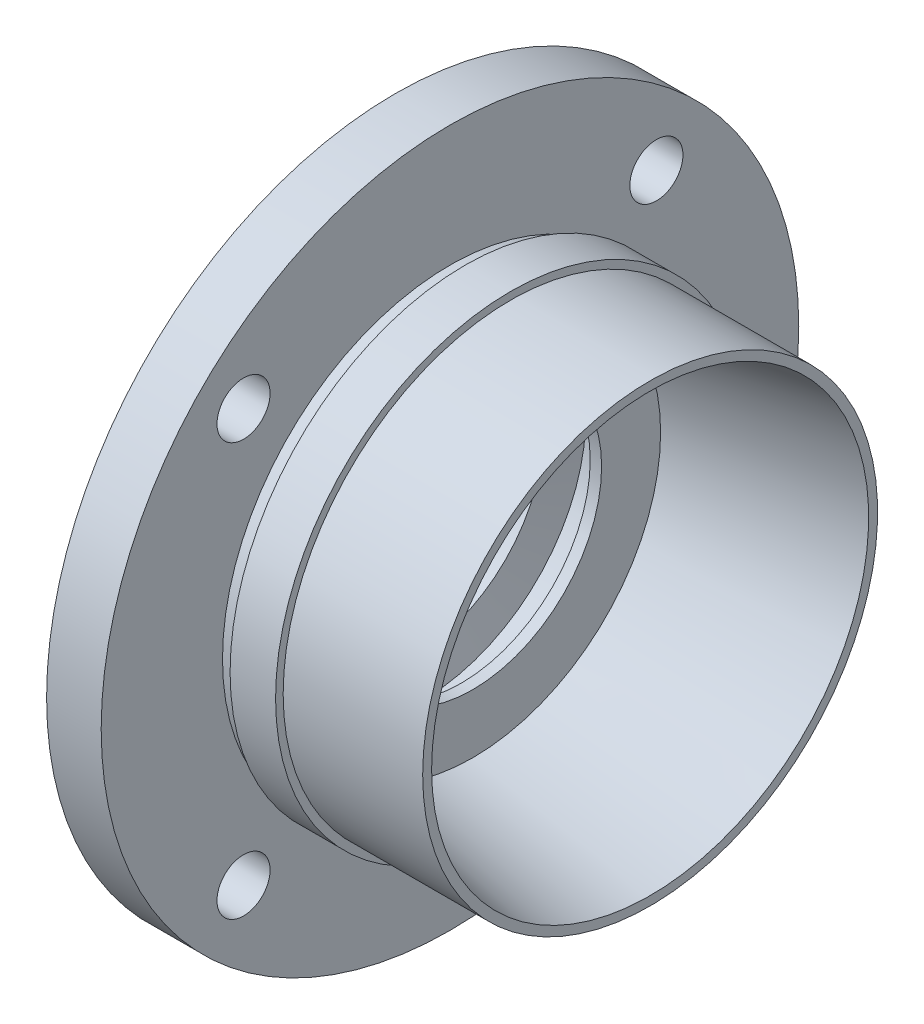
ISO-10303-21;
HEADER;
FILE_DESCRIPTION(('STEP AP214'),'2;1');
FILE_NAME('part.step','',(''),(''),'','','');
FILE_SCHEMA(('AUTOMOTIVE_DESIGN { 1 0 10303 214 1 1 1 1 }'));
ENDSEC;
DATA;
#1=APPLICATION_CONTEXT('core data for automotive mechanical design processes');
#2=APPLICATION_PROTOCOL_DEFINITION('international standard','automotive_design',2000,#1);
#3=PRODUCT_CONTEXT('',#1,'mechanical');
#4=PRODUCT('Part','Part','',(#3));
#5=PRODUCT_RELATED_PRODUCT_CATEGORY('part','',(#4));
#6=PRODUCT_DEFINITION_FORMATION('','',#4);
#7=PRODUCT_DEFINITION_CONTEXT('part definition',#1,'design');
#8=PRODUCT_DEFINITION('design','',#6,#7);
#9=PRODUCT_DEFINITION_SHAPE('','',#8);
#10=(LENGTH_UNIT() NAMED_UNIT(*) SI_UNIT(.MILLI.,.METRE.));
#11=(NAMED_UNIT(*) PLANE_ANGLE_UNIT() SI_UNIT($,.RADIAN.));
#12=(NAMED_UNIT(*) SI_UNIT($,.STERADIAN.) SOLID_ANGLE_UNIT());
#13=UNCERTAINTY_MEASURE_WITH_UNIT(LENGTH_MEASURE(1.E-05),#10,'distance_accuracy_value','');
#14=(GEOMETRIC_REPRESENTATION_CONTEXT(3) GLOBAL_UNCERTAINTY_ASSIGNED_CONTEXT((#13)) GLOBAL_UNIT_ASSIGNED_CONTEXT((#10,
#11,#12)) REPRESENTATION_CONTEXT('',''));
#15=CARTESIAN_POINT('',(0.,0.,0.));
#16=DIRECTION('',(0.,0.,1.));
#17=DIRECTION('',(1.,0.,0.));
#18=AXIS2_PLACEMENT_3D('',#15,#16,#17);
#19=CARTESIAN_POINT('',(3.6,0.,0.));
#20=DIRECTION('',(1.,0.,0.));
#21=DIRECTION('',(0.,0.,-1.));
#22=AXIS2_PLACEMENT_3D('',#19,#20,#21);
#23=CONICAL_SURFACE('',#22,21.5,1.33105321792444);
#24=CARTESIAN_POINT('',(2.5,0.,0.));
#25=DIRECTION('',(-1.,0.,0.));
#26=DIRECTION('',(0.,0.,1.));
#27=AXIS2_PLACEMENT_3D('',#24,#25,#26);
#28=CIRCLE('',#27,17.);
#29=CARTESIAN_POINT('',(2.5,0.,17.));
#30=VERTEX_POINT('',#29);
#31=EDGE_CURVE('E93',#30,#30,#28,.T.);
#32=ORIENTED_EDGE('',*,*,#31,.T.);
#33=EDGE_LOOP('',(#32));
#34=FACE_BOUND('',#33,.T.);
#35=CARTESIAN_POINT('',(3.6,0.,0.));
#36=DIRECTION('',(-1.,0.,0.));
#37=DIRECTION('',(0.,0.,1.));
#38=AXIS2_PLACEMENT_3D('',#35,#36,#37);
#39=CIRCLE('',#38,21.5);
#40=CARTESIAN_POINT('',(3.6,0.,21.5));
#41=VERTEX_POINT('',#40);
#42=EDGE_CURVE('E10',#41,#41,#39,.T.);
#43=ORIENTED_EDGE('',*,*,#42,.F.);
#44=EDGE_LOOP('',(#43));
#45=FACE_BOUND('',#44,.T.);
#46=ADVANCED_FACE('F35',(#34,#45),#23,.F.);
#47=CARTESIAN_POINT('',(0.,0.,0.));
#48=DIRECTION('',(-1.,0.,0.));
#49=DIRECTION('',(0.,0.,1.));
#50=AXIS2_PLACEMENT_3D('',#47,#48,#49);
#51=CYLINDRICAL_SURFACE('',#50,21.5);
#52=CARTESIAN_POINT('',(7.6,0.,0.));
#53=DIRECTION('',(-1.,0.,0.));
#54=DIRECTION('',(0.,0.,1.));
#55=AXIS2_PLACEMENT_3D('',#52,#53,#54);
#56=CIRCLE('',#55,21.5);
#57=CARTESIAN_POINT('',(7.6,0.,21.5));
#58=VERTEX_POINT('',#57);
#59=EDGE_CURVE('E41',#58,#58,#56,.T.);
#60=ORIENTED_EDGE('',*,*,#59,.F.);
#61=EDGE_LOOP('',(#60));
#62=FACE_BOUND('',#61,.T.);
#63=ORIENTED_EDGE('',*,*,#42,.T.);
#64=EDGE_LOOP('',(#63));
#65=FACE_BOUND('',#64,.T.);
#66=ADVANCED_FACE('F157',(#62,#65),#51,.F.);
#67=CARTESIAN_POINT('',(7.6,0.,0.));
#68=DIRECTION('',(-1.,0.,0.));
#69=DIRECTION('',(0.,0.,1.));
#70=AXIS2_PLACEMENT_3D('',#67,#68,#69);
#71=CONICAL_SURFACE('',#70,21.5,1.33105321792444);
#72=CARTESIAN_POINT('',(8.7,0.,0.));
#73=DIRECTION('',(-1.,0.,0.));
#74=DIRECTION('',(0.,0.,1.));
#75=AXIS2_PLACEMENT_3D('',#72,#73,#74);
#76=CIRCLE('',#75,17.);
#77=CARTESIAN_POINT('',(8.7,0.,17.));
#78=VERTEX_POINT('',#77);
#79=EDGE_CURVE('E45',#78,#78,#76,.T.);
#80=ORIENTED_EDGE('',*,*,#79,.F.);
#81=EDGE_LOOP('',(#80));
#82=FACE_BOUND('',#81,.T.);
#83=ORIENTED_EDGE('',*,*,#59,.T.);
#84=EDGE_LOOP('',(#83));
#85=FACE_BOUND('',#84,.T.);
#86=ADVANCED_FACE('F162',(#82,#85),#71,.F.);
#87=CARTESIAN_POINT('',(0.,0.,0.));
#88=DIRECTION('',(-1.,0.,0.));
#89=DIRECTION('',(0.,0.,1.));
#90=AXIS2_PLACEMENT_3D('',#87,#88,#89);
#91=CYLINDRICAL_SURFACE('',#90,17.);
#92=CARTESIAN_POINT('',(10.2,0.,0.));
#93=DIRECTION('',(-1.,0.,0.));
#94=DIRECTION('',(0.,0.,1.));
#95=AXIS2_PLACEMENT_3D('',#92,#93,#94);
#96=CIRCLE('',#95,17.);
#97=CARTESIAN_POINT('',(10.2,0.,17.));
#98=VERTEX_POINT('',#97);
#99=EDGE_CURVE('E49',#98,#98,#96,.T.);
#100=ORIENTED_EDGE('',*,*,#99,.F.);
#101=EDGE_LOOP('',(#100));
#102=FACE_BOUND('',#101,.T.);
#103=ORIENTED_EDGE('',*,*,#79,.T.);
#104=EDGE_LOOP('',(#103));
#105=FACE_BOUND('',#104,.T.);
#106=ADVANCED_FACE('F170',(#102,#105),#91,.F.);
#107=CARTESIAN_POINT('',(10.2,0.,0.));
#108=DIRECTION('',(-1.,0.,0.));
#109=DIRECTION('',(0.,0.,1.));
#110=AXIS2_PLACEMENT_3D('',#107,#108,#109);
#111=PLANE('',#110);
#112=CARTESIAN_POINT('',(10.2,0.,0.));
#113=DIRECTION('',(-1.,0.,0.));
#114=DIRECTION('',(0.,0.,1.));
#115=AXIS2_PLACEMENT_3D('',#112,#113,#114);
#116=CIRCLE('',#115,24.78);
#117=CARTESIAN_POINT('',(10.2,0.,24.78));
#118=VERTEX_POINT('',#117);
#119=EDGE_CURVE('E54',#118,#118,#116,.T.);
#120=ORIENTED_EDGE('',*,*,#119,.F.);
#121=EDGE_LOOP('',(#120));
#122=FACE_BOUND('',#121,.T.);
#123=ORIENTED_EDGE('',*,*,#99,.T.);
#124=EDGE_LOOP('',(#123));
#125=FACE_BOUND('',#124,.T.);
#126=ADVANCED_FACE('F176',(#122,#125),#111,.F.);
#127=CARTESIAN_POINT('',(10.2,0.,0.));
#128=DIRECTION('',(1.,0.,0.));
#129=DIRECTION('',(0.,0.,-1.));
#130=AXIS2_PLACEMENT_3D('',#127,#128,#129);
#131=CONICAL_SURFACE('',#130,24.78,0.171072068389931);
#132=CARTESIAN_POINT('',(33.6,0.,0.));
#133=DIRECTION('',(-1.,0.,0.));
#134=DIRECTION('',(0.,0.,1.));
#135=AXIS2_PLACEMENT_3D('',#132,#133,#134);
#136=CIRCLE('',#135,28.8226);
#137=CARTESIAN_POINT('',(33.6,0.,28.8226));
#138=VERTEX_POINT('',#137);
#139=EDGE_CURVE('E57',#138,#138,#136,.T.);
#140=ORIENTED_EDGE('',*,*,#139,.F.);
#141=EDGE_LOOP('',(#140));
#142=FACE_BOUND('',#141,.T.);
#143=ORIENTED_EDGE('',*,*,#119,.T.);
#144=EDGE_LOOP('',(#143));
#145=FACE_BOUND('',#144,.T.);
#146=ADVANCED_FACE('F180',(#142,#145),#131,.F.);
#147=CARTESIAN_POINT('',(33.6,0.,0.));
#148=DIRECTION('',(1.,0.,0.));
#149=DIRECTION('',(0.,0.,-1.));
#150=AXIS2_PLACEMENT_3D('',#147,#148,#149);
#151=PLANE('',#150);
#152=ORIENTED_EDGE('',*,*,#139,.T.);
#153=EDGE_LOOP('',(#152));
#154=FACE_BOUND('',#153,.T.);
#155=CARTESIAN_POINT('',(33.6,0.,0.));
#156=DIRECTION('',(-1.,0.,0.));
#157=DIRECTION('',(0.,0.,1.));
#158=AXIS2_PLACEMENT_3D('',#155,#156,#157);
#159=CIRCLE('',#158,30.);
#160=CARTESIAN_POINT('',(33.6,0.,30.));
#161=VERTEX_POINT('',#160);
#162=EDGE_CURVE('E60',#161,#161,#159,.T.);
#163=ORIENTED_EDGE('',*,*,#162,.F.);
#164=EDGE_LOOP('',(#163));
#165=FACE_BOUND('',#164,.T.);
#166=ADVANCED_FACE('F184',(#154,#165),#151,.T.);
#167=CARTESIAN_POINT('',(0.,0.,0.));
#168=DIRECTION('',(-1.,0.,0.));
#169=DIRECTION('',(0.,0.,1.));
#170=AXIS2_PLACEMENT_3D('',#167,#168,#169);
#171=CYLINDRICAL_SURFACE('',#170,30.);
#172=ORIENTED_EDGE('',*,*,#162,.T.);
#173=EDGE_LOOP('',(#172));
#174=FACE_BOUND('',#173,.T.);
#175=CARTESIAN_POINT('',(15.2,0.,0.));
#176=DIRECTION('',(-1.,0.,0.));
#177=DIRECTION('',(0.,0.,1.));
#178=AXIS2_PLACEMENT_3D('',#175,#176,#177);
#179=CIRCLE('',#178,30.);
#180=CARTESIAN_POINT('',(15.2,0.,30.));
#181=VERTEX_POINT('',#180);
#182=EDGE_CURVE('E63',#181,#181,#179,.T.);
#183=ORIENTED_EDGE('',*,*,#182,.F.);
#184=EDGE_LOOP('',(#183));
#185=FACE_BOUND('',#184,.T.);
#186=ADVANCED_FACE('F188',(#174,#185),#171,.T.);
#187=CARTESIAN_POINT('',(15.2,0.,0.));
#188=DIRECTION('',(1.,0.,0.));
#189=DIRECTION('',(0.,0.,-1.));
#190=AXIS2_PLACEMENT_3D('',#187,#188,#189);
#191=PLANE('',#190);
#192=ORIENTED_EDGE('',*,*,#182,.T.);
#193=EDGE_LOOP('',(#192));
#194=FACE_BOUND('',#193,.T.);
#195=CARTESIAN_POINT('',(15.2,0.,0.));
#196=DIRECTION('',(-1.,0.,0.));
#197=DIRECTION('',(0.,0.,1.));
#198=AXIS2_PLACEMENT_3D('',#195,#196,#197);
#199=CIRCLE('',#198,31.);
#200=CARTESIAN_POINT('',(15.2,0.,31.));
#201=VERTEX_POINT('',#200);
#202=EDGE_CURVE('E66',#201,#201,#199,.T.);
#203=ORIENTED_EDGE('',*,*,#202,.F.);
#204=EDGE_LOOP('',(#203));
#205=FACE_BOUND('',#204,.T.);
#206=ADVANCED_FACE('F192',(#194,#205),#191,.T.);
#207=CARTESIAN_POINT('',(0.,0.,0.));
#208=DIRECTION('',(-1.,0.,0.));
#209=DIRECTION('',(0.,0.,1.));
#210=AXIS2_PLACEMENT_3D('',#207,#208,#209);
#211=CYLINDRICAL_SURFACE('',#210,31.);
#212=ORIENTED_EDGE('',*,*,#202,.T.);
#213=EDGE_LOOP('',(#212));
#214=FACE_BOUND('',#213,.T.);
#215=CARTESIAN_POINT('',(9.2,0.,0.));
#216=DIRECTION('',(-1.,0.,0.));
#217=DIRECTION('',(0.,0.,1.));
#218=AXIS2_PLACEMENT_3D('',#215,#216,#217);
#219=CIRCLE('',#218,31.);
#220=CARTESIAN_POINT('',(9.2,0.,31.));
#221=VERTEX_POINT('',#220);
#222=EDGE_CURVE('E69',#221,#221,#219,.T.);
#223=ORIENTED_EDGE('',*,*,#222,.F.);
#224=EDGE_LOOP('',(#223));
#225=FACE_BOUND('',#224,.T.);
#226=ADVANCED_FACE('F196',(#214,#225),#211,.T.);
#227=CARTESIAN_POINT('',(9.2,0.,0.));
#228=DIRECTION('',(-1.,0.,0.));
#229=DIRECTION('',(0.,0.,1.));
#230=AXIS2_PLACEMENT_3D('',#227,#228,#229);
#231=PLANE('',#230);
#232=ORIENTED_EDGE('',*,*,#222,.T.);
#233=EDGE_LOOP('',(#232));
#234=FACE_BOUND('',#233,.T.);
#235=CARTESIAN_POINT('',(9.2,0.,0.));
#236=DIRECTION('',(-1.,0.,0.));
#237=DIRECTION('',(0.,0.,1.));
#238=AXIS2_PLACEMENT_3D('',#235,#236,#237);
#239=CIRCLE('',#238,30.);
#240=CARTESIAN_POINT('',(9.2,0.,30.));
#241=VERTEX_POINT('',#240);
#242=EDGE_CURVE('E72',#241,#241,#239,.T.);
#243=ORIENTED_EDGE('',*,*,#242,.F.);
#244=EDGE_LOOP('',(#243));
#245=FACE_BOUND('',#244,.T.);
#246=ADVANCED_FACE('F200',(#234,#245),#231,.T.);
#247=CARTESIAN_POINT('',(0.,0.,0.));
#248=DIRECTION('',(-1.,0.,0.));
#249=DIRECTION('',(0.,0.,1.));
#250=AXIS2_PLACEMENT_3D('',#247,#248,#249);
#251=CYLINDRICAL_SURFACE('',#250,30.);
#252=ORIENTED_EDGE('',*,*,#242,.T.);
#253=EDGE_LOOP('',(#252));
#254=FACE_BOUND('',#253,.T.);
#255=CARTESIAN_POINT('',(7.2,0.,0.));
#256=DIRECTION('',(-1.,0.,0.));
#257=DIRECTION('',(0.,0.,1.));
#258=AXIS2_PLACEMENT_3D('',#255,#256,#257);
#259=CIRCLE('',#258,30.);
#260=CARTESIAN_POINT('',(7.2,0.,30.));
#261=VERTEX_POINT('',#260);
#262=EDGE_CURVE('E75',#261,#261,#259,.T.);
#263=ORIENTED_EDGE('',*,*,#262,.F.);
#264=EDGE_LOOP('',(#263));
#265=FACE_BOUND('',#264,.T.);
#266=ADVANCED_FACE('F204',(#254,#265),#251,.T.);
#267=CARTESIAN_POINT('',(7.2,0.,0.));
#268=DIRECTION('',(1.,0.,0.));
#269=DIRECTION('',(0.,0.,-1.));
#270=AXIS2_PLACEMENT_3D('',#267,#268,#269);
#271=PLANE('',#270);
#272=CARTESIAN_POINT('',(7.2,-27.2236110756821,27.2236110756821));
#273=DIRECTION('',(1.,0.,0.));
#274=DIRECTION('',(0.,0.,-1.));
#275=AXIS2_PLACEMENT_3D('',#272,#273,#274);
#276=CIRCLE('',#275,3.5);
#277=CARTESIAN_POINT('',(7.2,-27.2236110756821,23.7236110756821));
#278=VERTEX_POINT('',#277);
#279=EDGE_CURVE('E114',#278,#278,#276,.T.);
#280=ORIENTED_EDGE('',*,*,#279,.F.);
#281=EDGE_LOOP('',(#280));
#282=FACE_BOUND('',#281,.T.);
#283=CARTESIAN_POINT('',(7.2,-27.2236110756821,-27.2236110756821));
#284=DIRECTION('',(1.,0.,0.));
#285=DIRECTION('',(0.,0.,-1.));
#286=AXIS2_PLACEMENT_3D('',#283,#284,#285);
#287=CIRCLE('',#286,3.5);
#288=CARTESIAN_POINT('',(7.2,-27.2236110756821,-30.7236110756821));
#289=VERTEX_POINT('',#288);
#290=EDGE_CURVE('E108',#289,#289,#287,.T.);
#291=ORIENTED_EDGE('',*,*,#290,.F.);
#292=EDGE_LOOP('',(#291));
#293=FACE_BOUND('',#292,.T.);
#294=CARTESIAN_POINT('',(7.2,27.2236110756821,27.2236110756821));
#295=DIRECTION('',(1.,0.,0.));
#296=DIRECTION('',(0.,0.,-1.));
#297=AXIS2_PLACEMENT_3D('',#294,#295,#296);
#298=CIRCLE('',#297,3.5);
#299=CARTESIAN_POINT('',(7.2,27.2236110756821,23.7236110756821));
#300=VERTEX_POINT('',#299);
#301=EDGE_CURVE('E102',#300,#300,#298,.T.);
#302=ORIENTED_EDGE('',*,*,#301,.F.);
#303=EDGE_LOOP('',(#302));
#304=FACE_BOUND('',#303,.T.);
#305=CARTESIAN_POINT('',(7.2,27.2236110756821,-27.2236110756821));
#306=DIRECTION('',(1.,0.,0.));
#307=DIRECTION('',(0.,0.,-1.));
#308=AXIS2_PLACEMENT_3D('',#305,#306,#307);
#309=CIRCLE('',#308,3.5);
#310=CARTESIAN_POINT('',(7.2,27.2236110756821,-30.7236110756821));
#311=VERTEX_POINT('',#310);
#312=EDGE_CURVE('E96',#311,#311,#309,.T.);
#313=ORIENTED_EDGE('',*,*,#312,.F.);
#314=EDGE_LOOP('',(#313));
#315=FACE_BOUND('',#314,.T.);
#316=ORIENTED_EDGE('',*,*,#262,.T.);
#317=EDGE_LOOP('',(#316));
#318=FACE_BOUND('',#317,.T.);
#319=CARTESIAN_POINT('',(7.2,0.,0.));
#320=DIRECTION('',(-1.,0.,0.));
#321=DIRECTION('',(0.,0.,1.));
#322=AXIS2_PLACEMENT_3D('',#319,#320,#321);
#323=CIRCLE('',#322,46.);
#324=CARTESIAN_POINT('',(7.2,0.,46.));
#325=VERTEX_POINT('',#324);
#326=EDGE_CURVE('E78',#325,#325,#323,.T.);
#327=ORIENTED_EDGE('',*,*,#326,.F.);
#328=EDGE_LOOP('',(#327));
#329=FACE_BOUND('',#328,.T.);
#330=ADVANCED_FACE('F208',(#282,#293,#304,#315,#318,#329),#271,.T.);
#331=CARTESIAN_POINT('',(0.,0.,0.));
#332=DIRECTION('',(-1.,0.,0.));
#333=DIRECTION('',(0.,0.,1.));
#334=AXIS2_PLACEMENT_3D('',#331,#332,#333);
#335=CYLINDRICAL_SURFACE('',#334,46.);
#336=ORIENTED_EDGE('',*,*,#326,.T.);
#337=EDGE_LOOP('',(#336));
#338=FACE_BOUND('',#337,.T.);
#339=CARTESIAN_POINT('',(0.,0.,0.));
#340=DIRECTION('',(-1.,0.,0.));
#341=DIRECTION('',(0.,0.,1.));
#342=AXIS2_PLACEMENT_3D('',#339,#340,#341);
#343=CIRCLE('',#342,46.);
#344=CARTESIAN_POINT('',(0.,0.,46.));
#345=VERTEX_POINT('',#344);
#346=EDGE_CURVE('E81',#345,#345,#343,.T.);
#347=ORIENTED_EDGE('',*,*,#346,.F.);
#348=EDGE_LOOP('',(#347));
#349=FACE_BOUND('',#348,.T.);
#350=ADVANCED_FACE('F127',(#338,#349),#335,.T.);
#351=CARTESIAN_POINT('',(0.,0.,0.));
#352=DIRECTION('',(-1.,0.,0.));
#353=DIRECTION('',(0.,0.,1.));
#354=AXIS2_PLACEMENT_3D('',#351,#352,#353);
#355=PLANE('',#354);
#356=CARTESIAN_POINT('',(0.,-27.2236110756821,27.2236110756821));
#357=DIRECTION('',(-1.,0.,0.));
#358=DIRECTION('',(0.,0.,1.));
#359=AXIS2_PLACEMENT_3D('',#356,#357,#358);
#360=CIRCLE('',#359,3.5);
#361=CARTESIAN_POINT('',(0.,-27.2236110756821,30.7236110756821));
#362=VERTEX_POINT('',#361);
#363=EDGE_CURVE('E117',#362,#362,#360,.T.);
#364=ORIENTED_EDGE('',*,*,#363,.F.);
#365=EDGE_LOOP('',(#364));
#366=FACE_BOUND('',#365,.T.);
#367=CARTESIAN_POINT('',(0.,-27.2236110756821,-27.2236110756821));
#368=DIRECTION('',(-1.,0.,0.));
#369=DIRECTION('',(0.,0.,1.));
#370=AXIS2_PLACEMENT_3D('',#367,#368,#369);
#371=CIRCLE('',#370,3.5);
#372=CARTESIAN_POINT('',(0.,-27.2236110756821,-23.7236110756821));
#373=VERTEX_POINT('',#372);
#374=EDGE_CURVE('E111',#373,#373,#371,.T.);
#375=ORIENTED_EDGE('',*,*,#374,.F.);
#376=EDGE_LOOP('',(#375));
#377=FACE_BOUND('',#376,.T.);
#378=CARTESIAN_POINT('',(0.,27.2236110756821,27.2236110756821));
#379=DIRECTION('',(-1.,0.,0.));
#380=DIRECTION('',(0.,0.,1.));
#381=AXIS2_PLACEMENT_3D('',#378,#379,#380);
#382=CIRCLE('',#381,3.5);
#383=CARTESIAN_POINT('',(0.,27.2236110756821,30.7236110756821));
#384=VERTEX_POINT('',#383);
#385=EDGE_CURVE('E105',#384,#384,#382,.T.);
#386=ORIENTED_EDGE('',*,*,#385,.F.);
#387=EDGE_LOOP('',(#386));
#388=FACE_BOUND('',#387,.T.);
#389=CARTESIAN_POINT('',(0.,27.2236110756821,-27.2236110756821));
#390=DIRECTION('',(-1.,0.,0.));
#391=DIRECTION('',(0.,0.,1.));
#392=AXIS2_PLACEMENT_3D('',#389,#390,#391);
#393=CIRCLE('',#392,3.5);
#394=CARTESIAN_POINT('',(0.,27.2236110756821,-23.7236110756821));
#395=VERTEX_POINT('',#394);
#396=EDGE_CURVE('E99',#395,#395,#393,.T.);
#397=ORIENTED_EDGE('',*,*,#396,.F.);
#398=EDGE_LOOP('',(#397));
#399=FACE_BOUND('',#398,.T.);
#400=ORIENTED_EDGE('',*,*,#346,.T.);
#401=EDGE_LOOP('',(#400));
#402=FACE_BOUND('',#401,.T.);
#403=CARTESIAN_POINT('',(0.,0.,0.));
#404=DIRECTION('',(-1.,0.,0.));
#405=DIRECTION('',(0.,0.,1.));
#406=AXIS2_PLACEMENT_3D('',#403,#404,#405);
#407=CIRCLE('',#406,30.);
#408=CARTESIAN_POINT('',(0.,0.,30.));
#409=VERTEX_POINT('',#408);
#410=EDGE_CURVE('E84',#409,#409,#407,.T.);
#411=ORIENTED_EDGE('',*,*,#410,.F.);
#412=EDGE_LOOP('',(#411));
#413=FACE_BOUND('',#412,.T.);
#414=ADVANCED_FACE('F123',(#366,#377,#388,#399,#402,#413),#355,.T.);
#415=CARTESIAN_POINT('',(0.,0.,0.));
#416=DIRECTION('',(-1.,0.,0.));
#417=DIRECTION('',(0.,0.,1.));
#418=AXIS2_PLACEMENT_3D('',#415,#416,#417);
#419=CYLINDRICAL_SURFACE('',#418,30.);
#420=ORIENTED_EDGE('',*,*,#410,.T.);
#421=EDGE_LOOP('',(#420));
#422=FACE_BOUND('',#421,.T.);
#423=CARTESIAN_POINT('',(1.,0.,0.));
#424=DIRECTION('',(-1.,0.,0.));
#425=DIRECTION('',(0.,0.,1.));
#426=AXIS2_PLACEMENT_3D('',#423,#424,#425);
#427=CIRCLE('',#426,30.);
#428=CARTESIAN_POINT('',(1.,0.,30.));
#429=VERTEX_POINT('',#428);
#430=EDGE_CURVE('E87',#429,#429,#427,.T.);
#431=ORIENTED_EDGE('',*,*,#430,.F.);
#432=EDGE_LOOP('',(#431));
#433=FACE_BOUND('',#432,.T.);
#434=ADVANCED_FACE('F126',(#422,#433),#419,.F.);
#435=CARTESIAN_POINT('',(1.,0.,0.));
#436=DIRECTION('',(1.,0.,0.));
#437=DIRECTION('',(0.,0.,-1.));
#438=AXIS2_PLACEMENT_3D('',#435,#436,#437);
#439=PLANE('',#438);
#440=CARTESIAN_POINT('',(1.,0.,0.));
#441=DIRECTION('',(-1.,0.,0.));
#442=DIRECTION('',(0.,0.,1.));
#443=AXIS2_PLACEMENT_3D('',#440,#441,#442);
#444=CIRCLE('',#443,17.);
#445=CARTESIAN_POINT('',(1.,0.,17.));
#446=VERTEX_POINT('',#445);
#447=EDGE_CURVE('E90',#446,#446,#444,.T.);
#448=ORIENTED_EDGE('',*,*,#447,.F.);
#449=EDGE_LOOP('',(#448));
#450=FACE_BOUND('',#449,.T.);
#451=ORIENTED_EDGE('',*,*,#430,.T.);
#452=EDGE_LOOP('',(#451));
#453=FACE_BOUND('',#452,.T.);
#454=ADVANCED_FACE('F141',(#450,#453),#439,.F.);
#455=CARTESIAN_POINT('',(0.,0.,0.));
#456=DIRECTION('',(-1.,0.,0.));
#457=DIRECTION('',(0.,0.,1.));
#458=AXIS2_PLACEMENT_3D('',#455,#456,#457);
#459=CYLINDRICAL_SURFACE('',#458,17.);
#460=ORIENTED_EDGE('',*,*,#31,.F.);
#461=EDGE_LOOP('',(#460));
#462=FACE_BOUND('',#461,.T.);
#463=ORIENTED_EDGE('',*,*,#447,.T.);
#464=EDGE_LOOP('',(#463));
#465=FACE_BOUND('',#464,.T.);
#466=ADVANCED_FACE('F146',(#462,#465),#459,.F.);
#467=CARTESIAN_POINT('',(33.6,27.2236110756821,-27.2236110756821));
#468=DIRECTION('',(-1.,0.,0.));
#469=DIRECTION('',(0.,0.,1.));
#470=AXIS2_PLACEMENT_3D('',#467,#468,#469);
#471=CYLINDRICAL_SURFACE('',#470,3.5);
#472=ORIENTED_EDGE('',*,*,#312,.T.);
#473=EDGE_LOOP('',(#472));
#474=FACE_BOUND('',#473,.T.);
#475=ORIENTED_EDGE('',*,*,#396,.T.);
#476=EDGE_LOOP('',(#475));
#477=FACE_BOUND('',#476,.T.);
#478=ADVANCED_FACE('F152',(#474,#477),#471,.F.);
#479=CARTESIAN_POINT('',(33.6,27.2236110756821,27.2236110756821));
#480=DIRECTION('',(-1.,0.,0.));
#481=DIRECTION('',(0.,0.,1.));
#482=AXIS2_PLACEMENT_3D('',#479,#480,#481);
#483=CYLINDRICAL_SURFACE('',#482,3.5);
#484=ORIENTED_EDGE('',*,*,#301,.T.);
#485=EDGE_LOOP('',(#484));
#486=FACE_BOUND('',#485,.T.);
#487=ORIENTED_EDGE('',*,*,#385,.T.);
#488=EDGE_LOOP('',(#487));
#489=FACE_BOUND('',#488,.T.);
#490=ADVANCED_FACE('F325',(#486,#489),#483,.F.);
#491=CARTESIAN_POINT('',(33.6,-27.2236110756821,-27.2236110756821));
#492=DIRECTION('',(-1.,0.,0.));
#493=DIRECTION('',(0.,0.,1.));
#494=AXIS2_PLACEMENT_3D('',#491,#492,#493);
#495=CYLINDRICAL_SURFACE('',#494,3.5);
#496=ORIENTED_EDGE('',*,*,#290,.T.);
#497=EDGE_LOOP('',(#496));
#498=FACE_BOUND('',#497,.T.);
#499=ORIENTED_EDGE('',*,*,#374,.T.);
#500=EDGE_LOOP('',(#499));
#501=FACE_BOUND('',#500,.T.);
#502=ADVANCED_FACE('F332',(#498,#501),#495,.F.);
#503=CARTESIAN_POINT('',(33.6,-27.2236110756821,27.2236110756821));
#504=DIRECTION('',(-1.,0.,0.));
#505=DIRECTION('',(0.,0.,1.));
#506=AXIS2_PLACEMENT_3D('',#503,#504,#505);
#507=CYLINDRICAL_SURFACE('',#506,3.5);
#508=ORIENTED_EDGE('',*,*,#279,.T.);
#509=EDGE_LOOP('',(#508));
#510=FACE_BOUND('',#509,.T.);
#511=ORIENTED_EDGE('',*,*,#363,.T.);
#512=EDGE_LOOP('',(#511));
#513=FACE_BOUND('',#512,.T.);
#514=ADVANCED_FACE('F121',(#510,#513),#507,.F.);
#515=CLOSED_SHELL('',(#46,#66,#86,#106,#126,#146,#166,#186,#206,#226,#246,#266,#330,#350,#414,
#434,#454,#466,#478,#490,#502,#514));
#516=MANIFOLD_SOLID_BREP('B2',#515);
#517=ADVANCED_BREP_SHAPE_REPRESENTATION('',(#18,#516),#14);
#518=SHAPE_DEFINITION_REPRESENTATION(#9,#517);
ENDSEC;
END-ISO-10303-21;
